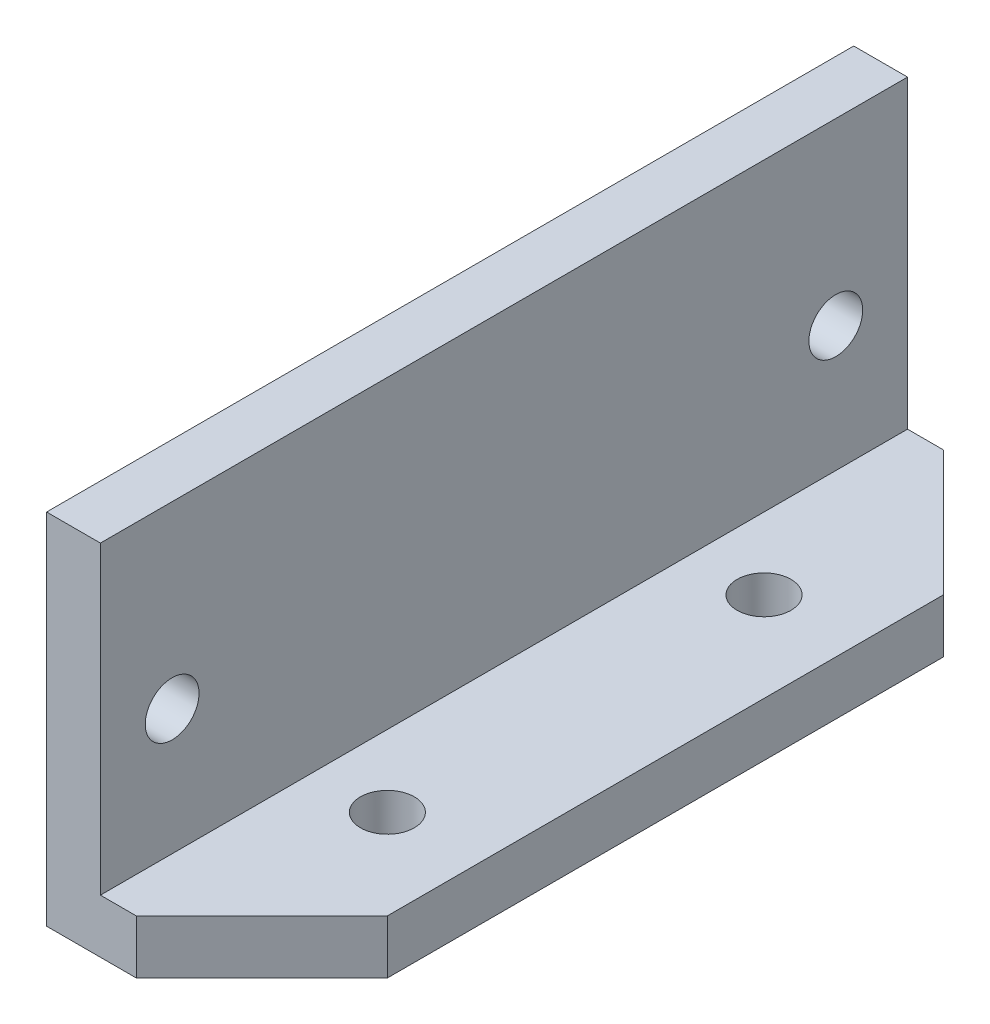
ISO-10303-21;
HEADER;
FILE_DESCRIPTION(('STEP AP214'),'2;1');
FILE_NAME('part.step','',(''),(''),'','','');
FILE_SCHEMA(('AUTOMOTIVE_DESIGN { 1 0 10303 214 1 1 1 1 }'));
ENDSEC;
DATA;
#1=APPLICATION_CONTEXT('core data for automotive mechanical design processes');
#2=APPLICATION_PROTOCOL_DEFINITION('international standard','automotive_design',2000,#1);
#3=PRODUCT_CONTEXT('',#1,'mechanical');
#4=PRODUCT('Part','Part','',(#3));
#5=PRODUCT_RELATED_PRODUCT_CATEGORY('part','',(#4));
#6=PRODUCT_DEFINITION_FORMATION('','',#4);
#7=PRODUCT_DEFINITION_CONTEXT('part definition',#1,'design');
#8=PRODUCT_DEFINITION('design','',#6,#7);
#9=PRODUCT_DEFINITION_SHAPE('','',#8);
#10=(LENGTH_UNIT() NAMED_UNIT(*) SI_UNIT(.MILLI.,.METRE.));
#11=(NAMED_UNIT(*) PLANE_ANGLE_UNIT() SI_UNIT($,.RADIAN.));
#12=(NAMED_UNIT(*) SI_UNIT($,.STERADIAN.) SOLID_ANGLE_UNIT());
#13=UNCERTAINTY_MEASURE_WITH_UNIT(LENGTH_MEASURE(1.E-05),#10,'distance_accuracy_value','');
#14=(GEOMETRIC_REPRESENTATION_CONTEXT(3) GLOBAL_UNCERTAINTY_ASSIGNED_CONTEXT((#13)) GLOBAL_UNIT_ASSIGNED_CONTEXT((#10,
#11,#12)) REPRESENTATION_CONTEXT('',''));
#15=CARTESIAN_POINT('',(0.,0.,0.));
#16=DIRECTION('',(0.,0.,1.));
#17=DIRECTION('',(1.,0.,0.));
#18=AXIS2_PLACEMENT_3D('',#15,#16,#17);
#19=CARTESIAN_POINT('',(-5.00907365826738,20.,45.));
#20=DIRECTION('',(0.,-1.,0.));
#21=DIRECTION('',(0.,0.,-1.));
#22=AXIS2_PLACEMENT_3D('',#19,#20,#21);
#23=PLANE('',#22);
#24=DIRECTION('',(-1.,0.,0.));
#25=VECTOR('',#24,1.);
#26=CARTESIAN_POINT('',(-5.00907365826738,20.,0.));
#27=LINE('',#26,#25);
#28=CARTESIAN_POINT('',(-2.00907365826738,20.,0.));
#29=VERTEX_POINT('',#28);
#30=CARTESIAN_POINT('',(-5.00907365826738,20.,0.));
#31=VERTEX_POINT('',#30);
#32=EDGE_CURVE('E131',#29,#31,#27,.T.);
#33=ORIENTED_EDGE('',*,*,#32,.T.);
#34=DIRECTION('',(0.,0.,-1.));
#35=VECTOR('',#34,1.);
#36=CARTESIAN_POINT('',(-5.00907365826738,20.,45.));
#37=LINE('',#36,#35);
#38=CARTESIAN_POINT('',(-5.00907365826738,20.,45.));
#39=VERTEX_POINT('',#38);
#40=EDGE_CURVE('E120',#39,#31,#37,.T.);
#41=ORIENTED_EDGE('',*,*,#40,.F.);
#42=DIRECTION('',(-1.,0.,0.));
#43=VECTOR('',#42,1.);
#44=CARTESIAN_POINT('',(-5.00907365826738,20.,45.));
#45=LINE('',#44,#43);
#46=CARTESIAN_POINT('',(-2.00907365826738,20.,45.));
#47=VERTEX_POINT('',#46);
#48=EDGE_CURVE('E173',#47,#39,#45,.T.);
#49=ORIENTED_EDGE('',*,*,#48,.F.);
#50=DIRECTION('',(0.,0.,-1.));
#51=VECTOR('',#50,1.);
#52=CARTESIAN_POINT('',(-2.00907365826738,20.,45.));
#53=LINE('',#52,#51);
#54=EDGE_CURVE('E158',#47,#29,#53,.T.);
#55=ORIENTED_EDGE('',*,*,#54,.T.);
#56=EDGE_LOOP('',(#33,#41,#49,#55));
#57=FACE_BOUND('',#56,.T.);
#58=ADVANCED_FACE('F34',(#57),#23,.F.);
#59=CARTESIAN_POINT('',(-5.00907365826738,0.,45.));
#60=DIRECTION('',(1.,0.,0.));
#61=DIRECTION('',(0.,0.,-1.));
#62=AXIS2_PLACEMENT_3D('',#59,#60,#61);
#63=PLANE('',#62);
#64=CARTESIAN_POINT('',(-5.00907365826738,10.,41.));
#65=DIRECTION('',(-1.,0.,0.));
#66=DIRECTION('',(0.,0.,-1.));
#67=AXIS2_PLACEMENT_3D('',#64,#65,#66);
#68=CIRCLE('',#67,1.5);
#69=CARTESIAN_POINT('',(-5.00907365826738,10.,39.5));
#70=VERTEX_POINT('',#69);
#71=EDGE_CURVE('E143',#70,#70,#68,.T.);
#72=ORIENTED_EDGE('',*,*,#71,.F.);
#73=EDGE_LOOP('',(#72));
#74=FACE_BOUND('',#73,.T.);
#75=CARTESIAN_POINT('',(-5.00907365826738,9.99999999999999,4.));
#76=DIRECTION('',(-1.,0.,0.));
#77=DIRECTION('',(0.,0.,1.));
#78=AXIS2_PLACEMENT_3D('',#75,#76,#77);
#79=CIRCLE('',#78,1.5);
#80=CARTESIAN_POINT('',(-5.00907365826738,9.99999999999999,5.5));
#81=VERTEX_POINT('',#80);
#82=EDGE_CURVE('E140',#81,#81,#79,.T.);
#83=ORIENTED_EDGE('',*,*,#82,.F.);
#84=EDGE_LOOP('',(#83));
#85=FACE_BOUND('',#84,.T.);
#86=DIRECTION('',(0.,-1.,0.));
#87=VECTOR('',#86,1.);
#88=CARTESIAN_POINT('',(-5.00907365826738,0.,0.));
#89=LINE('',#88,#87);
#90=CARTESIAN_POINT('',(-5.00907365826738,0.,0.));
#91=VERTEX_POINT('',#90);
#92=EDGE_CURVE('E166',#31,#91,#89,.T.);
#93=ORIENTED_EDGE('',*,*,#92,.T.);
#94=DIRECTION('',(0.,0.,-1.));
#95=VECTOR('',#94,1.);
#96=CARTESIAN_POINT('',(-5.00907365826738,0.,45.));
#97=LINE('',#96,#95);
#98=CARTESIAN_POINT('',(-5.00907365826738,0.,45.));
#99=VERTEX_POINT('',#98);
#100=EDGE_CURVE('E117',#99,#91,#97,.T.);
#101=ORIENTED_EDGE('',*,*,#100,.F.);
#102=DIRECTION('',(0.,-1.,0.));
#103=VECTOR('',#102,1.);
#104=CARTESIAN_POINT('',(-5.00907365826738,0.,45.));
#105=LINE('',#104,#103);
#106=EDGE_CURVE('E160',#39,#99,#105,.T.);
#107=ORIENTED_EDGE('',*,*,#106,.F.);
#108=ORIENTED_EDGE('',*,*,#40,.T.);
#109=EDGE_LOOP('',(#93,#101,#107,#108));
#110=FACE_BOUND('',#109,.T.);
#111=ADVANCED_FACE('F204',(#74,#85,#110),#63,.F.);
#112=CARTESIAN_POINT('',(6.99092634173262,0.,45.));
#113=DIRECTION('',(0.,1.,0.));
#114=DIRECTION('',(-1.,0.,0.));
#115=AXIS2_PLACEMENT_3D('',#112,#113,#114);
#116=PLANE('',#115);
#117=CARTESIAN_POINT('',(1.99092634173261,0.,12.));
#118=DIRECTION('',(0.,-1.,0.));
#119=DIRECTION('',(-1.,0.,0.));
#120=AXIS2_PLACEMENT_3D('',#117,#118,#119);
#121=CIRCLE('',#120,1.5);
#122=CARTESIAN_POINT('',(0.490926341732615,0.,12.));
#123=VERTEX_POINT('',#122);
#124=EDGE_CURVE('E136',#123,#123,#121,.T.);
#125=ORIENTED_EDGE('',*,*,#124,.F.);
#126=EDGE_LOOP('',(#125));
#127=FACE_BOUND('',#126,.T.);
#128=CARTESIAN_POINT('',(1.99092634173261,0.,33.));
#129=DIRECTION('',(0.,-1.,0.));
#130=DIRECTION('',(1.,0.,0.));
#131=AXIS2_PLACEMENT_3D('',#128,#129,#130);
#132=CIRCLE('',#131,1.5);
#133=CARTESIAN_POINT('',(3.49092634173262,0.,33.));
#134=VERTEX_POINT('',#133);
#135=EDGE_CURVE('E132',#134,#134,#132,.T.);
#136=ORIENTED_EDGE('',*,*,#135,.F.);
#137=EDGE_LOOP('',(#136));
#138=FACE_BOUND('',#137,.T.);
#139=DIRECTION('',(1.,0.,0.));
#140=VECTOR('',#139,1.);
#141=CARTESIAN_POINT('',(6.99092634173262,0.,0.));
#142=LINE('',#141,#140);
#143=CARTESIAN_POINT('',(-0.00907365826738251,0.,0.));
#144=VERTEX_POINT('',#143);
#145=EDGE_CURVE('E112',#91,#144,#142,.T.);
#146=ORIENTED_EDGE('',*,*,#145,.T.);
#147=DIRECTION('',(-0.707106781186548,0.,-0.707106781186547));
#148=VECTOR('',#147,1.);
#149=CARTESIAN_POINT('',(-0.00907365826738251,0.,0.));
#150=LINE('',#149,#148);
#151=CARTESIAN_POINT('',(6.99092634173262,0.,7.));
#152=VERTEX_POINT('',#151);
#153=EDGE_CURVE('E47',#152,#144,#150,.T.);
#154=ORIENTED_EDGE('',*,*,#153,.F.);
#155=DIRECTION('',(0.,0.,-1.));
#156=VECTOR('',#155,1.);
#157=CARTESIAN_POINT('',(6.99092634173262,0.,45.));
#158=LINE('',#157,#156);
#159=CARTESIAN_POINT('',(6.99092634173262,0.,38.));
#160=VERTEX_POINT('',#159);
#161=EDGE_CURVE('E109',#160,#152,#158,.T.);
#162=ORIENTED_EDGE('',*,*,#161,.F.);
#163=DIRECTION('',(0.707106781186548,0.,-0.707106781186547));
#164=VECTOR('',#163,1.);
#165=CARTESIAN_POINT('',(-0.00907365826738251,0.,45.));
#166=LINE('',#165,#164);
#167=CARTESIAN_POINT('',(-0.00907365826738251,0.,45.));
#168=VERTEX_POINT('',#167);
#169=EDGE_CURVE('E199',#168,#160,#166,.T.);
#170=ORIENTED_EDGE('',*,*,#169,.F.);
#171=DIRECTION('',(1.,0.,0.));
#172=VECTOR('',#171,1.);
#173=CARTESIAN_POINT('',(6.99092634173262,0.,45.));
#174=LINE('',#173,#172);
#175=EDGE_CURVE('E151',#99,#168,#174,.T.);
#176=ORIENTED_EDGE('',*,*,#175,.F.);
#177=ORIENTED_EDGE('',*,*,#100,.T.);
#178=EDGE_LOOP('',(#146,#154,#162,#170,#176,#177));
#179=FACE_BOUND('',#178,.T.);
#180=ADVANCED_FACE('F107',(#127,#138,#179),#116,.F.);
#181=CARTESIAN_POINT('',(6.99092634173262,3.,45.));
#182=DIRECTION('',(-1.,0.,0.));
#183=DIRECTION('',(0.,0.,1.));
#184=AXIS2_PLACEMENT_3D('',#181,#182,#183);
#185=PLANE('',#184);
#186=ORIENTED_EDGE('',*,*,#161,.T.);
#187=DIRECTION('',(0.,-1.,0.));
#188=VECTOR('',#187,1.);
#189=CARTESIAN_POINT('',(6.99092634173262,20.,7.));
#190=LINE('',#189,#188);
#191=CARTESIAN_POINT('',(6.99092634173262,3.,7.));
#192=VERTEX_POINT('',#191);
#193=EDGE_CURVE('E95',#192,#152,#190,.T.);
#194=ORIENTED_EDGE('',*,*,#193,.F.);
#195=DIRECTION('',(0.,0.,-1.));
#196=VECTOR('',#195,1.);
#197=CARTESIAN_POINT('',(6.99092634173262,3.,45.));
#198=LINE('',#197,#196);
#199=CARTESIAN_POINT('',(6.99092634173262,3.,38.));
#200=VERTEX_POINT('',#199);
#201=EDGE_CURVE('E118',#200,#192,#198,.T.);
#202=ORIENTED_EDGE('',*,*,#201,.F.);
#203=DIRECTION('',(0.,-1.,0.));
#204=VECTOR('',#203,1.);
#205=CARTESIAN_POINT('',(6.99092634173262,20.,38.));
#206=LINE('',#205,#204);
#207=EDGE_CURVE('E116',#200,#160,#206,.T.);
#208=ORIENTED_EDGE('',*,*,#207,.T.);
#209=EDGE_LOOP('',(#186,#194,#202,#208));
#210=FACE_BOUND('',#209,.T.);
#211=ADVANCED_FACE('F115',(#210),#185,.F.);
#212=CARTESIAN_POINT('',(-2.00907365826738,3.,45.));
#213=DIRECTION('',(0.,-1.,0.));
#214=DIRECTION('',(0.,0.,-1.));
#215=AXIS2_PLACEMENT_3D('',#212,#213,#214);
#216=PLANE('',#215);
#217=CARTESIAN_POINT('',(1.99092634173262,3.,12.));
#218=DIRECTION('',(0.,-1.,0.));
#219=DIRECTION('',(0.,0.,-1.));
#220=AXIS2_PLACEMENT_3D('',#217,#218,#219);
#221=CIRCLE('',#220,1.5);
#222=CARTESIAN_POINT('',(1.99092634173262,3.,10.5));
#223=VERTEX_POINT('',#222);
#224=EDGE_CURVE('E133',#223,#223,#221,.T.);
#225=ORIENTED_EDGE('',*,*,#224,.T.);
#226=EDGE_LOOP('',(#225));
#227=FACE_BOUND('',#226,.T.);
#228=CARTESIAN_POINT('',(1.99092634173262,3.,33.));
#229=DIRECTION('',(0.,-1.,0.));
#230=DIRECTION('',(0.,0.,-1.));
#231=AXIS2_PLACEMENT_3D('',#228,#229,#230);
#232=CIRCLE('',#231,1.5);
#233=CARTESIAN_POINT('',(1.99092634173262,3.,31.5));
#234=VERTEX_POINT('',#233);
#235=EDGE_CURVE('E128',#234,#234,#232,.T.);
#236=ORIENTED_EDGE('',*,*,#235,.T.);
#237=EDGE_LOOP('',(#236));
#238=FACE_BOUND('',#237,.T.);
#239=ORIENTED_EDGE('',*,*,#201,.T.);
#240=DIRECTION('',(-0.707106781186548,0.,-0.707106781186547));
#241=VECTOR('',#240,1.);
#242=CARTESIAN_POINT('',(21.4909263417326,3.,21.5));
#243=LINE('',#242,#241);
#244=CARTESIAN_POINT('',(-0.0090736582673824,3.,0.));
#245=VERTEX_POINT('',#244);
#246=EDGE_CURVE('E98',#192,#245,#243,.T.);
#247=ORIENTED_EDGE('',*,*,#246,.T.);
#248=DIRECTION('',(-1.,0.,0.));
#249=VECTOR('',#248,1.);
#250=CARTESIAN_POINT('',(-2.00907365826738,3.,0.));
#251=LINE('',#250,#249);
#252=CARTESIAN_POINT('',(-2.00907365826738,3.,0.));
#253=VERTEX_POINT('',#252);
#254=EDGE_CURVE('E169',#245,#253,#251,.T.);
#255=ORIENTED_EDGE('',*,*,#254,.T.);
#256=DIRECTION('',(0.,0.,-1.));
#257=VECTOR('',#256,1.);
#258=CARTESIAN_POINT('',(-2.00907365826738,3.,45.));
#259=LINE('',#258,#257);
#260=CARTESIAN_POINT('',(-2.00907365826738,3.,45.));
#261=VERTEX_POINT('',#260);
#262=EDGE_CURVE('E122',#261,#253,#259,.T.);
#263=ORIENTED_EDGE('',*,*,#262,.F.);
#264=DIRECTION('',(-1.,0.,0.));
#265=VECTOR('',#264,1.);
#266=CARTESIAN_POINT('',(-2.00907365826738,3.,45.));
#267=LINE('',#266,#265);
#268=CARTESIAN_POINT('',(-0.00907365826738208,3.,45.));
#269=VERTEX_POINT('',#268);
#270=EDGE_CURVE('E148',#269,#261,#267,.T.);
#271=ORIENTED_EDGE('',*,*,#270,.F.);
#272=DIRECTION('',(0.707106781186548,0.,-0.707106781186547));
#273=VECTOR('',#272,1.);
#274=CARTESIAN_POINT('',(-1.00907365826738,3.,46.));
#275=LINE('',#274,#273);
#276=EDGE_CURVE('E55',#269,#200,#275,.T.);
#277=ORIENTED_EDGE('',*,*,#276,.T.);
#278=EDGE_LOOP('',(#239,#247,#255,#263,#271,#277));
#279=FACE_BOUND('',#278,.T.);
#280=ADVANCED_FACE('F153',(#227,#238,#279),#216,.F.);
#281=CARTESIAN_POINT('',(-2.00907365826738,20.,45.));
#282=DIRECTION('',(-1.,0.,0.));
#283=DIRECTION('',(0.,-1.,0.));
#284=AXIS2_PLACEMENT_3D('',#281,#282,#283);
#285=PLANE('',#284);
#286=CARTESIAN_POINT('',(-2.00907365826738,10.,41.));
#287=DIRECTION('',(-1.,0.,0.));
#288=DIRECTION('',(0.,-1.,0.));
#289=AXIS2_PLACEMENT_3D('',#286,#287,#288);
#290=CIRCLE('',#289,1.5);
#291=CARTESIAN_POINT('',(-2.00907365826738,8.49999999999999,41.));
#292=VERTEX_POINT('',#291);
#293=EDGE_CURVE('E141',#292,#292,#290,.T.);
#294=ORIENTED_EDGE('',*,*,#293,.T.);
#295=EDGE_LOOP('',(#294));
#296=FACE_BOUND('',#295,.T.);
#297=CARTESIAN_POINT('',(-2.00907365826738,9.99999999999999,4.));
#298=DIRECTION('',(-1.,0.,0.));
#299=DIRECTION('',(0.,-1.,0.));
#300=AXIS2_PLACEMENT_3D('',#297,#298,#299);
#301=CIRCLE('',#300,1.5);
#302=CARTESIAN_POINT('',(-2.00907365826738,8.49999999999999,4.));
#303=VERTEX_POINT('',#302);
#304=EDGE_CURVE('E137',#303,#303,#301,.T.);
#305=ORIENTED_EDGE('',*,*,#304,.T.);
#306=EDGE_LOOP('',(#305));
#307=FACE_BOUND('',#306,.T.);
#308=DIRECTION('',(0.,1.,0.));
#309=VECTOR('',#308,1.);
#310=CARTESIAN_POINT('',(-2.00907365826738,20.,0.));
#311=LINE('',#310,#309);
#312=EDGE_CURVE('E171',#253,#29,#311,.T.);
#313=ORIENTED_EDGE('',*,*,#312,.T.);
#314=ORIENTED_EDGE('',*,*,#54,.F.);
#315=DIRECTION('',(0.,1.,0.));
#316=VECTOR('',#315,1.);
#317=CARTESIAN_POINT('',(-2.00907365826738,20.,45.));
#318=LINE('',#317,#316);
#319=EDGE_CURVE('E156',#261,#47,#318,.T.);
#320=ORIENTED_EDGE('',*,*,#319,.F.);
#321=ORIENTED_EDGE('',*,*,#262,.T.);
#322=EDGE_LOOP('',(#313,#314,#320,#321));
#323=FACE_BOUND('',#322,.T.);
#324=ADVANCED_FACE('F177',(#296,#307,#323),#285,.F.);
#325=CARTESIAN_POINT('',(0.,0.,45.));
#326=DIRECTION('',(0.,0.,-1.));
#327=DIRECTION('',(-1.,0.,0.));
#328=AXIS2_PLACEMENT_3D('',#325,#326,#327);
#329=PLANE('',#328);
#330=ORIENTED_EDGE('',*,*,#175,.T.);
#331=DIRECTION('',(0.,1.,0.));
#332=VECTOR('',#331,1.);
#333=CARTESIAN_POINT('',(-0.00907365826738251,0.,45.));
#334=LINE('',#333,#332);
#335=EDGE_CURVE('E41',#168,#269,#334,.T.);
#336=ORIENTED_EDGE('',*,*,#335,.T.);
#337=ORIENTED_EDGE('',*,*,#270,.T.);
#338=ORIENTED_EDGE('',*,*,#319,.T.);
#339=ORIENTED_EDGE('',*,*,#48,.T.);
#340=ORIENTED_EDGE('',*,*,#106,.T.);
#341=EDGE_LOOP('',(#330,#336,#337,#338,#339,#340));
#342=FACE_BOUND('',#341,.T.);
#343=ADVANCED_FACE('F147',(#342),#329,.F.);
#344=CARTESIAN_POINT('',(0.,0.,0.));
#345=DIRECTION('',(0.,0.,-1.));
#346=DIRECTION('',(-1.,0.,0.));
#347=AXIS2_PLACEMENT_3D('',#344,#345,#346);
#348=PLANE('',#347);
#349=DIRECTION('',(0.,1.,0.));
#350=VECTOR('',#349,1.);
#351=CARTESIAN_POINT('',(-0.00907365826738251,0.,0.));
#352=LINE('',#351,#350);
#353=EDGE_CURVE('E11',#144,#245,#352,.T.);
#354=ORIENTED_EDGE('',*,*,#353,.F.);
#355=ORIENTED_EDGE('',*,*,#145,.F.);
#356=ORIENTED_EDGE('',*,*,#92,.F.);
#357=ORIENTED_EDGE('',*,*,#32,.F.);
#358=ORIENTED_EDGE('',*,*,#312,.F.);
#359=ORIENTED_EDGE('',*,*,#254,.F.);
#360=EDGE_LOOP('',(#354,#355,#356,#357,#358,#359));
#361=FACE_BOUND('',#360,.T.);
#362=ADVANCED_FACE('F182',(#361),#348,.T.);
#363=CARTESIAN_POINT('',(1.99092634173262,20.,33.));
#364=DIRECTION('',(0.,-1.,0.));
#365=DIRECTION('',(1.,0.,0.));
#366=AXIS2_PLACEMENT_3D('',#363,#364,#365);
#367=CYLINDRICAL_SURFACE('',#366,1.5);
#368=ORIENTED_EDGE('',*,*,#135,.T.);
#369=EDGE_LOOP('',(#368));
#370=FACE_BOUND('',#369,.T.);
#371=ORIENTED_EDGE('',*,*,#235,.F.);
#372=EDGE_LOOP('',(#371));
#373=FACE_BOUND('',#372,.T.);
#374=ADVANCED_FACE('F226',(#370,#373),#367,.F.);
#375=CARTESIAN_POINT('',(1.99092634173262,20.,12.));
#376=DIRECTION('',(0.,-1.,0.));
#377=DIRECTION('',(1.,0.,0.));
#378=AXIS2_PLACEMENT_3D('',#375,#376,#377);
#379=CYLINDRICAL_SURFACE('',#378,1.5);
#380=ORIENTED_EDGE('',*,*,#124,.T.);
#381=EDGE_LOOP('',(#380));
#382=FACE_BOUND('',#381,.T.);
#383=ORIENTED_EDGE('',*,*,#224,.F.);
#384=EDGE_LOOP('',(#383));
#385=FACE_BOUND('',#384,.T.);
#386=ADVANCED_FACE('F231',(#382,#385),#379,.F.);
#387=CARTESIAN_POINT('',(6.99092634173262,9.99999999999999,4.));
#388=DIRECTION('',(-1.,0.,0.));
#389=DIRECTION('',(0.,0.,1.));
#390=AXIS2_PLACEMENT_3D('',#387,#388,#389);
#391=CYLINDRICAL_SURFACE('',#390,1.5);
#392=ORIENTED_EDGE('',*,*,#82,.T.);
#393=EDGE_LOOP('',(#392));
#394=FACE_BOUND('',#393,.T.);
#395=ORIENTED_EDGE('',*,*,#304,.F.);
#396=EDGE_LOOP('',(#395));
#397=FACE_BOUND('',#396,.T.);
#398=ADVANCED_FACE('F235',(#394,#397),#391,.F.);
#399=CARTESIAN_POINT('',(6.99092634173262,10.,41.));
#400=DIRECTION('',(-1.,0.,0.));
#401=DIRECTION('',(0.,0.,1.));
#402=AXIS2_PLACEMENT_3D('',#399,#400,#401);
#403=CYLINDRICAL_SURFACE('',#402,1.5);
#404=ORIENTED_EDGE('',*,*,#71,.T.);
#405=EDGE_LOOP('',(#404));
#406=FACE_BOUND('',#405,.T.);
#407=ORIENTED_EDGE('',*,*,#293,.F.);
#408=EDGE_LOOP('',(#407));
#409=FACE_BOUND('',#408,.T.);
#410=ADVANCED_FACE('F239',(#406,#409),#403,.F.);
#411=CARTESIAN_POINT('',(-0.00907365826738179,20.,45.));
#412=DIRECTION('',(-0.707106781186547,0.,-0.707106781186548));
#413=DIRECTION('',(-0.707106781186548,0.,0.707106781186547));
#414=AXIS2_PLACEMENT_3D('',#411,#412,#413);
#415=PLANE('',#414);
#416=ORIENTED_EDGE('',*,*,#335,.F.);
#417=ORIENTED_EDGE('',*,*,#169,.T.);
#418=ORIENTED_EDGE('',*,*,#207,.F.);
#419=ORIENTED_EDGE('',*,*,#276,.F.);
#420=EDGE_LOOP('',(#416,#417,#418,#419));
#421=FACE_BOUND('',#420,.T.);
#422=ADVANCED_FACE('F201',(#421),#415,.F.);
#423=CARTESIAN_POINT('',(-0.00907365826738179,20.,0.));
#424=DIRECTION('',(-0.707106781186547,0.,0.707106781186548));
#425=DIRECTION('',(0.707106781186548,0.,0.707106781186547));
#426=AXIS2_PLACEMENT_3D('',#423,#424,#425);
#427=PLANE('',#426);
#428=ORIENTED_EDGE('',*,*,#193,.T.);
#429=ORIENTED_EDGE('',*,*,#153,.T.);
#430=ORIENTED_EDGE('',*,*,#353,.T.);
#431=ORIENTED_EDGE('',*,*,#246,.F.);
#432=EDGE_LOOP('',(#428,#429,#430,#431));
#433=FACE_BOUND('',#432,.T.);
#434=ADVANCED_FACE('F96',(#433),#427,.F.);
#435=CLOSED_SHELL('',(#58,#111,#180,#211,#280,#324,#343,#362,#374,#386,#398,#410,#422,#434));
#436=MANIFOLD_SOLID_BREP('B2',#435);
#437=ADVANCED_BREP_SHAPE_REPRESENTATION('',(#18,#436),#14);
#438=SHAPE_DEFINITION_REPRESENTATION(#9,#437);
ENDSEC;
END-ISO-10303-21;
